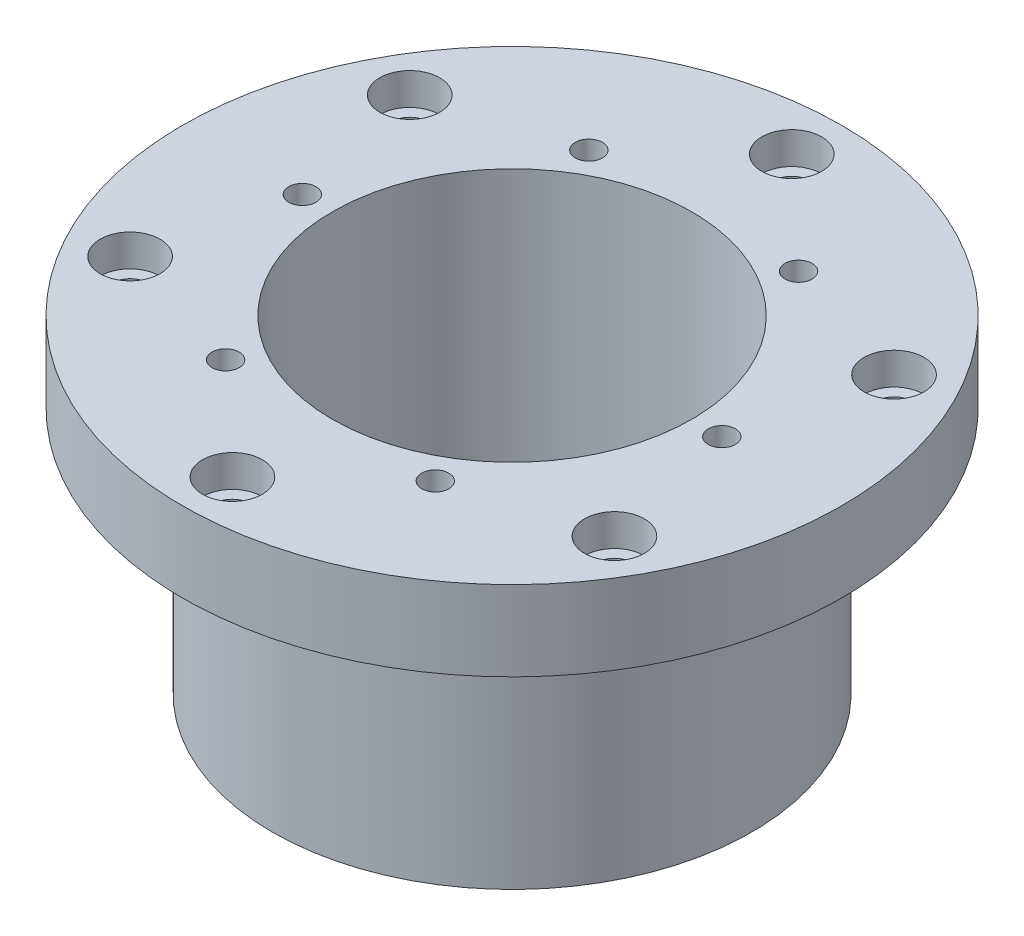
ISO-10303-21;
HEADER;
FILE_DESCRIPTION(('STEP AP214'),'2;1');
FILE_NAME('part.step','',(''),(''),'','','');
FILE_SCHEMA(('AUTOMOTIVE_DESIGN { 1 0 10303 214 1 1 1 1 }'));
ENDSEC;
DATA;
#1=APPLICATION_CONTEXT('core data for automotive mechanical design processes');
#2=APPLICATION_PROTOCOL_DEFINITION('international standard','automotive_design',2000,#1);
#3=PRODUCT_CONTEXT('',#1,'mechanical');
#4=PRODUCT('Part','Part','',(#3));
#5=PRODUCT_RELATED_PRODUCT_CATEGORY('part','',(#4));
#6=PRODUCT_DEFINITION_FORMATION('','',#4);
#7=PRODUCT_DEFINITION_CONTEXT('part definition',#1,'design');
#8=PRODUCT_DEFINITION('design','',#6,#7);
#9=PRODUCT_DEFINITION_SHAPE('','',#8);
#10=(LENGTH_UNIT() NAMED_UNIT(*) SI_UNIT(.MILLI.,.METRE.));
#11=(NAMED_UNIT(*) PLANE_ANGLE_UNIT() SI_UNIT($,.RADIAN.));
#12=(NAMED_UNIT(*) SI_UNIT($,.STERADIAN.) SOLID_ANGLE_UNIT());
#13=UNCERTAINTY_MEASURE_WITH_UNIT(LENGTH_MEASURE(1.E-05),#10,'distance_accuracy_value','');
#14=(GEOMETRIC_REPRESENTATION_CONTEXT(3) GLOBAL_UNCERTAINTY_ASSIGNED_CONTEXT((#13)) GLOBAL_UNIT_ASSIGNED_CONTEXT((#10,
#11,#12)) REPRESENTATION_CONTEXT('',''));
#15=CARTESIAN_POINT('',(0.,0.,0.));
#16=DIRECTION('',(0.,0.,1.));
#17=DIRECTION('',(1.,0.,0.));
#18=AXIS2_PLACEMENT_3D('',#15,#16,#17);
#19=CARTESIAN_POINT('',(0.,-62.,0.));
#20=DIRECTION('',(0.,-1.,0.));
#21=DIRECTION('',(0.,0.,-1.));
#22=AXIS2_PLACEMENT_3D('',#19,#20,#21);
#23=PLANE('',#22);
#24=CARTESIAN_POINT('',(0.,-62.,0.));
#25=DIRECTION('',(0.,1.,0.));
#26=DIRECTION('',(0.,0.,1.));
#27=AXIS2_PLACEMENT_3D('',#24,#25,#26);
#28=CIRCLE('',#27,60.);
#29=CARTESIAN_POINT('',(0.,-62.,60.));
#30=VERTEX_POINT('',#29);
#31=EDGE_CURVE('E166',#30,#30,#28,.T.);
#32=ORIENTED_EDGE('',*,*,#31,.F.);
#33=EDGE_LOOP('',(#32));
#34=FACE_BOUND('',#33,.T.);
#35=CARTESIAN_POINT('',(0.,-62.,0.));
#36=DIRECTION('',(0.,1.,0.));
#37=DIRECTION('',(0.,0.,1.));
#38=AXIS2_PLACEMENT_3D('',#35,#36,#37);
#39=CIRCLE('',#38,37.5);
#40=CARTESIAN_POINT('',(0.,-62.,37.5));
#41=VERTEX_POINT('',#40);
#42=EDGE_CURVE('E20',#41,#41,#39,.T.);
#43=ORIENTED_EDGE('',*,*,#42,.T.);
#44=EDGE_LOOP('',(#43));
#45=FACE_BOUND('',#44,.T.);
#46=ADVANCED_FACE('F17',(#34,#45),#23,.T.);
#47=CARTESIAN_POINT('',(0.,-62.,0.));
#48=DIRECTION('',(0.,1.,0.));
#49=DIRECTION('',(0.,0.,1.));
#50=AXIS2_PLACEMENT_3D('',#47,#48,#49);
#51=CYLINDRICAL_SURFACE('',#50,37.5);
#52=CARTESIAN_POINT('',(0.,-52.,0.));
#53=DIRECTION('',(0.,1.,0.));
#54=DIRECTION('',(0.,0.,1.));
#55=AXIS2_PLACEMENT_3D('',#52,#53,#54);
#56=CIRCLE('',#55,37.5);
#57=CARTESIAN_POINT('',(0.,-52.,37.5));
#58=VERTEX_POINT('',#57);
#59=EDGE_CURVE('E146',#58,#58,#56,.F.);
#60=ORIENTED_EDGE('',*,*,#59,.F.);
#61=EDGE_LOOP('',(#60));
#62=FACE_BOUND('',#61,.T.);
#63=ORIENTED_EDGE('',*,*,#42,.F.);
#64=EDGE_LOOP('',(#63));
#65=FACE_BOUND('',#64,.T.);
#66=ADVANCED_FACE('F174',(#62,#65),#51,.F.);
#67=CARTESIAN_POINT('',(60.6217782649103,20.,-35.0000000000007));
#68=DIRECTION('',(0.,1.,0.));
#69=DIRECTION('',(0.,0.,1.));
#70=AXIS2_PLACEMENT_3D('',#67,#68,#69);
#71=CYLINDRICAL_SURFACE('',#70,4.5);
#72=CARTESIAN_POINT('',(60.6217782649103,0.,-35.0000000000007));
#73=DIRECTION('',(0.,1.,0.));
#74=DIRECTION('',(0.,0.,1.));
#75=AXIS2_PLACEMENT_3D('',#72,#73,#74);
#76=CIRCLE('',#75,4.5);
#77=CARTESIAN_POINT('',(60.6217782649103,0.,-30.5000000000007));
#78=VERTEX_POINT('',#77);
#79=EDGE_CURVE('E143',#78,#78,#76,.F.);
#80=ORIENTED_EDGE('',*,*,#79,.T.);
#81=EDGE_LOOP('',(#80));
#82=FACE_BOUND('',#81,.T.);
#83=CARTESIAN_POINT('',(60.6217782649103,12.,-35.0000000000007));
#84=DIRECTION('',(0.,1.,0.));
#85=DIRECTION('',(0.,0.,1.));
#86=AXIS2_PLACEMENT_3D('',#83,#84,#85);
#87=CIRCLE('',#86,4.5);
#88=CARTESIAN_POINT('',(60.6217782649103,12.,-30.5000000000007));
#89=VERTEX_POINT('',#88);
#90=EDGE_CURVE('E164',#89,#89,#87,.T.);
#91=ORIENTED_EDGE('',*,*,#90,.T.);
#92=EDGE_LOOP('',(#91));
#93=FACE_BOUND('',#92,.T.);
#94=ADVANCED_FACE('F176',(#82,#93),#71,.F.);
#95=CARTESIAN_POINT('',(60.621778264911,20.,34.9999999999995));
#96=DIRECTION('',(0.,1.,0.));
#97=DIRECTION('',(0.,0.,1.));
#98=AXIS2_PLACEMENT_3D('',#95,#96,#97);
#99=CYLINDRICAL_SURFACE('',#98,4.5);
#100=CARTESIAN_POINT('',(60.621778264911,0.,34.9999999999995));
#101=DIRECTION('',(0.,1.,0.));
#102=DIRECTION('',(0.,0.,1.));
#103=AXIS2_PLACEMENT_3D('',#100,#101,#102);
#104=CIRCLE('',#103,4.5);
#105=CARTESIAN_POINT('',(60.621778264911,0.,39.4999999999995));
#106=VERTEX_POINT('',#105);
#107=EDGE_CURVE('E140',#106,#106,#104,.F.);
#108=ORIENTED_EDGE('',*,*,#107,.T.);
#109=EDGE_LOOP('',(#108));
#110=FACE_BOUND('',#109,.T.);
#111=CARTESIAN_POINT('',(60.621778264911,12.,34.9999999999995));
#112=DIRECTION('',(0.,1.,0.));
#113=DIRECTION('',(0.,0.,1.));
#114=AXIS2_PLACEMENT_3D('',#111,#112,#113);
#115=CIRCLE('',#114,4.5);
#116=CARTESIAN_POINT('',(60.621778264911,12.,39.4999999999995));
#117=VERTEX_POINT('',#116);
#118=EDGE_CURVE('E161',#117,#117,#115,.T.);
#119=ORIENTED_EDGE('',*,*,#118,.T.);
#120=EDGE_LOOP('',(#119));
#121=FACE_BOUND('',#120,.T.);
#122=ADVANCED_FACE('F184',(#110,#121),#99,.F.);
#123=CARTESIAN_POINT('',(0.,20.,70.));
#124=DIRECTION('',(0.,1.,0.));
#125=DIRECTION('',(0.,0.,1.));
#126=AXIS2_PLACEMENT_3D('',#123,#124,#125);
#127=CYLINDRICAL_SURFACE('',#126,4.5);
#128=CARTESIAN_POINT('',(0.,0.,70.));
#129=DIRECTION('',(0.,1.,0.));
#130=DIRECTION('',(0.,0.,1.));
#131=AXIS2_PLACEMENT_3D('',#128,#129,#130);
#132=CIRCLE('',#131,4.5);
#133=CARTESIAN_POINT('',(0.,0.,74.5));
#134=VERTEX_POINT('',#133);
#135=EDGE_CURVE('E137',#134,#134,#132,.F.);
#136=ORIENTED_EDGE('',*,*,#135,.T.);
#137=EDGE_LOOP('',(#136));
#138=FACE_BOUND('',#137,.T.);
#139=CARTESIAN_POINT('',(0.,12.,70.));
#140=DIRECTION('',(0.,1.,0.));
#141=DIRECTION('',(0.,0.,1.));
#142=AXIS2_PLACEMENT_3D('',#139,#140,#141);
#143=CIRCLE('',#142,4.5);
#144=CARTESIAN_POINT('',(0.,12.,74.5));
#145=VERTEX_POINT('',#144);
#146=EDGE_CURVE('E158',#145,#145,#143,.T.);
#147=ORIENTED_EDGE('',*,*,#146,.T.);
#148=EDGE_LOOP('',(#147));
#149=FACE_BOUND('',#148,.T.);
#150=ADVANCED_FACE('F316',(#138,#149),#127,.F.);
#151=CARTESIAN_POINT('',(-60.6217782649106,20.,35.));
#152=DIRECTION('',(0.,1.,0.));
#153=DIRECTION('',(0.,0.,1.));
#154=AXIS2_PLACEMENT_3D('',#151,#152,#153);
#155=CYLINDRICAL_SURFACE('',#154,4.5);
#156=CARTESIAN_POINT('',(-60.6217782649106,0.,35.));
#157=DIRECTION('',(0.,1.,0.));
#158=DIRECTION('',(0.,0.,1.));
#159=AXIS2_PLACEMENT_3D('',#156,#157,#158);
#160=CIRCLE('',#159,4.5);
#161=CARTESIAN_POINT('',(-60.6217782649106,0.,39.5));
#162=VERTEX_POINT('',#161);
#163=EDGE_CURVE('E134',#162,#162,#160,.F.);
#164=ORIENTED_EDGE('',*,*,#163,.T.);
#165=EDGE_LOOP('',(#164));
#166=FACE_BOUND('',#165,.T.);
#167=CARTESIAN_POINT('',(-60.6217782649106,12.,35.));
#168=DIRECTION('',(0.,1.,0.));
#169=DIRECTION('',(0.,0.,1.));
#170=AXIS2_PLACEMENT_3D('',#167,#168,#169);
#171=CIRCLE('',#170,4.5);
#172=CARTESIAN_POINT('',(-60.6217782649106,12.,39.5));
#173=VERTEX_POINT('',#172);
#174=EDGE_CURVE('E155',#173,#173,#171,.T.);
#175=ORIENTED_EDGE('',*,*,#174,.T.);
#176=EDGE_LOOP('',(#175));
#177=FACE_BOUND('',#176,.T.);
#178=ADVANCED_FACE('F312',(#166,#177),#155,.F.);
#179=CARTESIAN_POINT('',(-60.6217782649108,20.,-35.));
#180=DIRECTION('',(0.,1.,0.));
#181=DIRECTION('',(0.,0.,1.));
#182=AXIS2_PLACEMENT_3D('',#179,#180,#181);
#183=CYLINDRICAL_SURFACE('',#182,4.5);
#184=CARTESIAN_POINT('',(-60.6217782649108,0.,-35.));
#185=DIRECTION('',(0.,1.,0.));
#186=DIRECTION('',(0.,0.,1.));
#187=AXIS2_PLACEMENT_3D('',#184,#185,#186);
#188=CIRCLE('',#187,4.5);
#189=CARTESIAN_POINT('',(-60.6217782649108,0.,-30.5));
#190=VERTEX_POINT('',#189);
#191=EDGE_CURVE('E131',#190,#190,#188,.F.);
#192=ORIENTED_EDGE('',*,*,#191,.T.);
#193=EDGE_LOOP('',(#192));
#194=FACE_BOUND('',#193,.T.);
#195=CARTESIAN_POINT('',(-60.6217782649108,12.,-35.));
#196=DIRECTION('',(0.,1.,0.));
#197=DIRECTION('',(0.,0.,1.));
#198=AXIS2_PLACEMENT_3D('',#195,#196,#197);
#199=CIRCLE('',#198,4.5);
#200=CARTESIAN_POINT('',(-60.6217782649108,12.,-30.5));
#201=VERTEX_POINT('',#200);
#202=EDGE_CURVE('E152',#201,#201,#199,.T.);
#203=ORIENTED_EDGE('',*,*,#202,.T.);
#204=EDGE_LOOP('',(#203));
#205=FACE_BOUND('',#204,.T.);
#206=ADVANCED_FACE('F308',(#194,#205),#183,.F.);
#207=CARTESIAN_POINT('',(0.,20.,-70.));
#208=DIRECTION('',(0.,1.,0.));
#209=DIRECTION('',(0.,0.,1.));
#210=AXIS2_PLACEMENT_3D('',#207,#208,#209);
#211=CYLINDRICAL_SURFACE('',#210,4.5);
#212=CARTESIAN_POINT('',(0.,0.,-70.));
#213=DIRECTION('',(0.,1.,0.));
#214=DIRECTION('',(0.,0.,1.));
#215=AXIS2_PLACEMENT_3D('',#212,#213,#214);
#216=CIRCLE('',#215,4.5);
#217=CARTESIAN_POINT('',(0.,0.,-65.5));
#218=VERTEX_POINT('',#217);
#219=EDGE_CURVE('E62',#218,#218,#216,.F.);
#220=ORIENTED_EDGE('',*,*,#219,.T.);
#221=EDGE_LOOP('',(#220));
#222=FACE_BOUND('',#221,.T.);
#223=CARTESIAN_POINT('',(0.,12.,-70.));
#224=DIRECTION('',(0.,1.,0.));
#225=DIRECTION('',(0.,0.,1.));
#226=AXIS2_PLACEMENT_3D('',#223,#224,#225);
#227=CIRCLE('',#226,4.5);
#228=CARTESIAN_POINT('',(0.,12.,-65.5));
#229=VERTEX_POINT('',#228);
#230=EDGE_CURVE('E149',#229,#229,#227,.T.);
#231=ORIENTED_EDGE('',*,*,#230,.T.);
#232=EDGE_LOOP('',(#231));
#233=FACE_BOUND('',#232,.T.);
#234=ADVANCED_FACE('F305',(#222,#233),#211,.F.);
#235=CARTESIAN_POINT('',(0.,-62.,0.));
#236=DIRECTION('',(0.,1.,0.));
#237=DIRECTION('',(0.,0.,1.));
#238=AXIS2_PLACEMENT_3D('',#235,#236,#237);
#239=CYLINDRICAL_SURFACE('',#238,60.);
#240=ORIENTED_EDGE('',*,*,#31,.T.);
#241=EDGE_LOOP('',(#240));
#242=FACE_BOUND('',#241,.T.);
#243=CARTESIAN_POINT('',(0.,0.,0.));
#244=DIRECTION('',(0.,1.,0.));
#245=DIRECTION('',(0.,0.,1.));
#246=AXIS2_PLACEMENT_3D('',#243,#244,#245);
#247=CIRCLE('',#246,60.);
#248=CARTESIAN_POINT('',(0.,0.,60.));
#249=VERTEX_POINT('',#248);
#250=EDGE_CURVE('E56',#249,#249,#247,.F.);
#251=ORIENTED_EDGE('',*,*,#250,.T.);
#252=EDGE_LOOP('',(#251));
#253=FACE_BOUND('',#252,.T.);
#254=ADVANCED_FACE('F49',(#242,#253),#239,.T.);
#255=CARTESIAN_POINT('',(26.2500000000006,0.249999999994089,45.4663336986827));
#256=DIRECTION('',(0.,1.,0.));
#257=DIRECTION('',(0.,0.,1.));
#258=AXIS2_PLACEMENT_3D('',#255,#256,#257);
#259=CONICAL_SURFACE('',#258,3.40000000012838,1.02974425869086);
#260=CARTESIAN_POINT('',(26.2500000000006,-1.79292610468451,45.4663336986259));
#261=VERTEX_POINT('',#260);
#262=VERTEX_LOOP('',#261);
#263=FACE_BOUND('',#262,.T.);
#264=CARTESIAN_POINT('',(26.2500000000006,0.250000000000066,45.4663336986827));
#265=DIRECTION('',(0.,1.,0.));
#266=DIRECTION('',(0.,0.,1.));
#267=AXIS2_PLACEMENT_3D('',#264,#265,#266);
#268=CIRCLE('',#267,3.39999999999976);
#269=CARTESIAN_POINT('',(26.2500000000006,0.250000000000066,48.8663336986825));
#270=VERTEX_POINT('',#269);
#271=EDGE_CURVE('E53',#270,#270,#268,.T.);
#272=ORIENTED_EDGE('',*,*,#271,.T.);
#273=EDGE_LOOP('',(#272));
#274=FACE_BOUND('',#273,.T.);
#275=ADVANCED_FACE('F45',(#263,#274),#259,.F.);
#276=CARTESIAN_POINT('',(-26.2499999999996,0.249999999937245,45.4663336986833));
#277=DIRECTION('',(0.,1.,0.));
#278=DIRECTION('',(0.,0.,1.));
#279=AXIS2_PLACEMENT_3D('',#276,#277,#278);
#280=CONICAL_SURFACE('',#279,3.3999999999573,1.0297442586087);
#281=CARTESIAN_POINT('',(-26.2499999999996,-1.7929261047982,45.4663336987401));
#282=VERTEX_POINT('',#281);
#283=VERTEX_LOOP('',#282);
#284=FACE_BOUND('',#283,.T.);
#285=CARTESIAN_POINT('',(-26.2499999999996,0.250000000000066,45.4663336986833));
#286=DIRECTION('',(0.,1.,0.));
#287=DIRECTION('',(0.,0.,1.));
#288=AXIS2_PLACEMENT_3D('',#285,#286,#287);
#289=CIRCLE('',#288,3.39999999999976);
#290=CARTESIAN_POINT('',(-26.2499999999996,0.250000000000066,48.8663336986831));
#291=VERTEX_POINT('',#290);
#292=EDGE_CURVE('E55',#291,#291,#289,.T.);
#293=ORIENTED_EDGE('',*,*,#292,.T.);
#294=EDGE_LOOP('',(#293));
#295=FACE_BOUND('',#294,.T.);
#296=ADVANCED_FACE('F48',(#284,#295),#280,.F.);
#297=CARTESIAN_POINT('',(-52.5,0.249999999937245,0.));
#298=DIRECTION('',(0.,1.,0.));
#299=DIRECTION('',(0.,0.,1.));
#300=AXIS2_PLACEMENT_3D('',#297,#298,#299);
#301=CONICAL_SURFACE('',#300,3.3999999998855,1.02974425863677);
#302=CARTESIAN_POINT('',(-52.5,-1.79292610468451,5.6843418860808E-11));
#303=VERTEX_POINT('',#302);
#304=VERTEX_LOOP('',#303);
#305=FACE_BOUND('',#304,.T.);
#306=CARTESIAN_POINT('',(-52.5,0.250000000000066,0.));
#307=DIRECTION('',(0.,1.,0.));
#308=DIRECTION('',(0.,0.,1.));
#309=AXIS2_PLACEMENT_3D('',#306,#307,#308);
#310=CIRCLE('',#309,3.39999999999975);
#311=CARTESIAN_POINT('',(-52.5,0.250000000000066,3.39999999999975));
#312=VERTEX_POINT('',#311);
#313=EDGE_CURVE('E59',#312,#312,#310,.T.);
#314=ORIENTED_EDGE('',*,*,#313,.T.);
#315=EDGE_LOOP('',(#314));
#316=FACE_BOUND('',#315,.T.);
#317=ADVANCED_FACE('F296',(#305,#316),#301,.F.);
#318=CARTESIAN_POINT('',(-26.25,0.250000000107775,-45.4663336986829));
#319=DIRECTION('',(0.,1.,0.));
#320=DIRECTION('',(0.,0.,1.));
#321=AXIS2_PLACEMENT_3D('',#318,#319,#320);
#322=CONICAL_SURFACE('',#321,3.40000000009754,1.02974425867217);
#323=CARTESIAN_POINT('',(-26.25,-1.79292610462767,-45.4663336986261));
#324=VERTEX_POINT('',#323);
#325=VERTEX_LOOP('',#324);
#326=FACE_BOUND('',#325,.T.);
#327=CARTESIAN_POINT('',(-26.25,0.250000000000066,-45.4663336986829));
#328=DIRECTION('',(0.,1.,0.));
#329=DIRECTION('',(0.,0.,1.));
#330=AXIS2_PLACEMENT_3D('',#327,#328,#329);
#331=CIRCLE('',#330,3.39999999999975);
#332=CARTESIAN_POINT('',(-26.25,0.250000000000066,-42.0663336986832));
#333=VERTEX_POINT('',#332);
#334=EDGE_CURVE('E595',#333,#333,#331,.T.);
#335=ORIENTED_EDGE('',*,*,#334,.T.);
#336=EDGE_LOOP('',(#335));
#337=FACE_BOUND('',#336,.T.);
#338=ADVANCED_FACE('F292',(#326,#337),#322,.F.);
#339=CARTESIAN_POINT('',(26.25,0.249999999937245,-45.4663336986831));
#340=DIRECTION('',(0.,1.,0.));
#341=DIRECTION('',(0.,0.,1.));
#342=AXIS2_PLACEMENT_3D('',#339,#340,#341);
#343=CONICAL_SURFACE('',#342,3.39999999987034,1.02974425862055);
#344=CARTESIAN_POINT('',(26.25,-1.79292610474135,-45.4663336986262));
#345=VERTEX_POINT('',#344);
#346=VERTEX_LOOP('',#345);
#347=FACE_BOUND('',#346,.T.);
#348=CARTESIAN_POINT('',(26.25,0.250000000000066,-45.4663336986831));
#349=DIRECTION('',(0.,1.,0.));
#350=DIRECTION('',(0.,0.,1.));
#351=AXIS2_PLACEMENT_3D('',#348,#349,#350);
#352=CIRCLE('',#351,3.39999999999976);
#353=CARTESIAN_POINT('',(26.25,0.250000000000066,-42.0663336986833));
#354=VERTEX_POINT('',#353);
#355=EDGE_CURVE('E597',#354,#354,#352,.T.);
#356=ORIENTED_EDGE('',*,*,#355,.T.);
#357=EDGE_LOOP('',(#356));
#358=FACE_BOUND('',#357,.T.);
#359=ADVANCED_FACE('F289',(#347,#358),#343,.F.);
#360=CARTESIAN_POINT('',(52.5,0.249999999937245,0.));
#361=DIRECTION('',(0.,1.,0.));
#362=DIRECTION('',(0.,0.,1.));
#363=AXIS2_PLACEMENT_3D('',#360,#361,#362);
#364=CONICAL_SURFACE('',#363,3.3999999998855,1.02974425863677);
#365=CARTESIAN_POINT('',(52.5,-1.79292610468451,5.6843418860808E-11));
#366=VERTEX_POINT('',#365);
#367=VERTEX_LOOP('',#366);
#368=FACE_BOUND('',#367,.T.);
#369=CARTESIAN_POINT('',(52.5,0.250000000000066,0.));
#370=DIRECTION('',(0.,1.,0.));
#371=DIRECTION('',(0.,0.,1.));
#372=AXIS2_PLACEMENT_3D('',#369,#370,#371);
#373=CIRCLE('',#372,3.39999999999975);
#374=CARTESIAN_POINT('',(52.5,0.250000000000066,3.39999999999975));
#375=VERTEX_POINT('',#374);
#376=EDGE_CURVE('E127',#375,#375,#373,.T.);
#377=ORIENTED_EDGE('',*,*,#376,.T.);
#378=EDGE_LOOP('',(#377));
#379=FACE_BOUND('',#378,.T.);
#380=ADVANCED_FACE('F285',(#368,#379),#364,.F.);
#381=CARTESIAN_POINT('',(65.1217782649103,12.,-35.0000000000007));
#382=DIRECTION('',(0.,-1.,0.));
#383=DIRECTION('',(0.,0.,-1.));
#384=AXIS2_PLACEMENT_3D('',#381,#382,#383);
#385=PLANE('',#384);
#386=CARTESIAN_POINT('',(60.6217782649103,12.,-35.0000000000007));
#387=DIRECTION('',(0.,1.,0.));
#388=DIRECTION('',(0.,0.,1.));
#389=AXIS2_PLACEMENT_3D('',#386,#387,#388);
#390=CIRCLE('',#389,7.5);
#391=CARTESIAN_POINT('',(60.6217782649103,12.,-27.5000000000007));
#392=VERTEX_POINT('',#391);
#393=EDGE_CURVE('E125',#392,#392,#390,.T.);
#394=ORIENTED_EDGE('',*,*,#393,.T.);
#395=EDGE_LOOP('',(#394));
#396=FACE_BOUND('',#395,.T.);
#397=ORIENTED_EDGE('',*,*,#90,.F.);
#398=EDGE_LOOP('',(#397));
#399=FACE_BOUND('',#398,.T.);
#400=ADVANCED_FACE('F281',(#396,#399),#385,.F.);
#401=CARTESIAN_POINT('',(65.121778264911,12.,34.9999999999995));
#402=DIRECTION('',(0.,-1.,0.));
#403=DIRECTION('',(0.,0.,-1.));
#404=AXIS2_PLACEMENT_3D('',#401,#402,#403);
#405=PLANE('',#404);
#406=CARTESIAN_POINT('',(60.621778264911,12.,34.9999999999995));
#407=DIRECTION('',(0.,1.,0.));
#408=DIRECTION('',(0.,0.,1.));
#409=AXIS2_PLACEMENT_3D('',#406,#407,#408);
#410=CIRCLE('',#409,7.5);
#411=CARTESIAN_POINT('',(60.621778264911,12.,42.4999999999995));
#412=VERTEX_POINT('',#411);
#413=EDGE_CURVE('E122',#412,#412,#410,.T.);
#414=ORIENTED_EDGE('',*,*,#413,.T.);
#415=EDGE_LOOP('',(#414));
#416=FACE_BOUND('',#415,.T.);
#417=ORIENTED_EDGE('',*,*,#118,.F.);
#418=EDGE_LOOP('',(#417));
#419=FACE_BOUND('',#418,.T.);
#420=ADVANCED_FACE('F277',(#416,#419),#405,.F.);
#421=CARTESIAN_POINT('',(4.5,12.,70.));
#422=DIRECTION('',(0.,-1.,0.));
#423=DIRECTION('',(0.,0.,-1.));
#424=AXIS2_PLACEMENT_3D('',#421,#422,#423);
#425=PLANE('',#424);
#426=CARTESIAN_POINT('',(0.,12.,70.));
#427=DIRECTION('',(0.,1.,0.));
#428=DIRECTION('',(0.,0.,1.));
#429=AXIS2_PLACEMENT_3D('',#426,#427,#428);
#430=CIRCLE('',#429,7.5);
#431=CARTESIAN_POINT('',(0.,12.,77.5));
#432=VERTEX_POINT('',#431);
#433=EDGE_CURVE('E119',#432,#432,#430,.T.);
#434=ORIENTED_EDGE('',*,*,#433,.T.);
#435=EDGE_LOOP('',(#434));
#436=FACE_BOUND('',#435,.T.);
#437=ORIENTED_EDGE('',*,*,#146,.F.);
#438=EDGE_LOOP('',(#437));
#439=FACE_BOUND('',#438,.T.);
#440=ADVANCED_FACE('F273',(#436,#439),#425,.F.);
#441=CARTESIAN_POINT('',(-56.1217782649106,12.,35.));
#442=DIRECTION('',(0.,-1.,0.));
#443=DIRECTION('',(0.,0.,-1.));
#444=AXIS2_PLACEMENT_3D('',#441,#442,#443);
#445=PLANE('',#444);
#446=CARTESIAN_POINT('',(-60.6217782649106,12.,35.));
#447=DIRECTION('',(0.,1.,0.));
#448=DIRECTION('',(0.,0.,1.));
#449=AXIS2_PLACEMENT_3D('',#446,#447,#448);
#450=CIRCLE('',#449,7.5);
#451=CARTESIAN_POINT('',(-60.6217782649106,12.,42.5));
#452=VERTEX_POINT('',#451);
#453=EDGE_CURVE('E116',#452,#452,#450,.T.);
#454=ORIENTED_EDGE('',*,*,#453,.T.);
#455=EDGE_LOOP('',(#454));
#456=FACE_BOUND('',#455,.T.);
#457=ORIENTED_EDGE('',*,*,#174,.F.);
#458=EDGE_LOOP('',(#457));
#459=FACE_BOUND('',#458,.T.);
#460=ADVANCED_FACE('F269',(#456,#459),#445,.F.);
#461=CARTESIAN_POINT('',(-56.1217782649108,12.,-35.));
#462=DIRECTION('',(0.,-1.,0.));
#463=DIRECTION('',(0.,0.,-1.));
#464=AXIS2_PLACEMENT_3D('',#461,#462,#463);
#465=PLANE('',#464);
#466=CARTESIAN_POINT('',(-60.6217782649108,12.,-35.));
#467=DIRECTION('',(0.,1.,0.));
#468=DIRECTION('',(0.,0.,1.));
#469=AXIS2_PLACEMENT_3D('',#466,#467,#468);
#470=CIRCLE('',#469,7.5);
#471=CARTESIAN_POINT('',(-60.6217782649108,12.,-27.5));
#472=VERTEX_POINT('',#471);
#473=EDGE_CURVE('E113',#472,#472,#470,.T.);
#474=ORIENTED_EDGE('',*,*,#473,.T.);
#475=EDGE_LOOP('',(#474));
#476=FACE_BOUND('',#475,.T.);
#477=ORIENTED_EDGE('',*,*,#202,.F.);
#478=EDGE_LOOP('',(#477));
#479=FACE_BOUND('',#478,.T.);
#480=ADVANCED_FACE('F265',(#476,#479),#465,.F.);
#481=CARTESIAN_POINT('',(4.5,12.,-70.));
#482=DIRECTION('',(0.,-1.,0.));
#483=DIRECTION('',(0.,0.,-1.));
#484=AXIS2_PLACEMENT_3D('',#481,#482,#483);
#485=PLANE('',#484);
#486=CARTESIAN_POINT('',(0.,12.,-70.));
#487=DIRECTION('',(0.,1.,0.));
#488=DIRECTION('',(0.,0.,1.));
#489=AXIS2_PLACEMENT_3D('',#486,#487,#488);
#490=CIRCLE('',#489,7.5);
#491=CARTESIAN_POINT('',(0.,12.,-62.5));
#492=VERTEX_POINT('',#491);
#493=EDGE_CURVE('E110',#492,#492,#490,.T.);
#494=ORIENTED_EDGE('',*,*,#493,.T.);
#495=EDGE_LOOP('',(#494));
#496=FACE_BOUND('',#495,.T.);
#497=ORIENTED_EDGE('',*,*,#230,.F.);
#498=EDGE_LOOP('',(#497));
#499=FACE_BOUND('',#498,.T.);
#500=ADVANCED_FACE('F261',(#496,#499),#485,.F.);
#501=CARTESIAN_POINT('',(0.,-52.,0.));
#502=DIRECTION('',(0.,1.,0.));
#503=DIRECTION('',(0.,0.,1.));
#504=AXIS2_PLACEMENT_3D('',#501,#502,#503);
#505=PLANE('',#504);
#506=CARTESIAN_POINT('',(0.,-52.,0.));
#507=DIRECTION('',(0.,1.,0.));
#508=DIRECTION('',(0.,0.,1.));
#509=AXIS2_PLACEMENT_3D('',#506,#507,#508);
#510=CIRCLE('',#509,45.);
#511=CARTESIAN_POINT('',(0.,-52.,45.));
#512=VERTEX_POINT('',#511);
#513=EDGE_CURVE('E107',#512,#512,#510,.T.);
#514=ORIENTED_EDGE('',*,*,#513,.T.);
#515=EDGE_LOOP('',(#514));
#516=FACE_BOUND('',#515,.T.);
#517=ORIENTED_EDGE('',*,*,#59,.T.);
#518=EDGE_LOOP('',(#517));
#519=FACE_BOUND('',#518,.T.);
#520=ADVANCED_FACE('F257',(#516,#519),#505,.T.);
#521=CARTESIAN_POINT('',(0.,0.,0.));
#522=DIRECTION('',(0.,1.,0.));
#523=DIRECTION('',(0.,0.,1.));
#524=AXIS2_PLACEMENT_3D('',#521,#522,#523);
#525=PLANE('',#524);
#526=ORIENTED_EDGE('',*,*,#250,.F.);
#527=EDGE_LOOP('',(#526));
#528=FACE_BOUND('',#527,.T.);
#529=CARTESIAN_POINT('',(0.,0.,0.));
#530=DIRECTION('',(0.,-1.,0.));
#531=DIRECTION('',(0.,0.,-1.));
#532=AXIS2_PLACEMENT_3D('',#529,#530,#531);
#533=CIRCLE('',#532,82.5);
#534=CARTESIAN_POINT('',(0.,0.,-82.5));
#535=VERTEX_POINT('',#534);
#536=EDGE_CURVE('E104',#535,#535,#533,.F.);
#537=ORIENTED_EDGE('',*,*,#536,.F.);
#538=EDGE_LOOP('',(#537));
#539=FACE_BOUND('',#538,.T.);
#540=ORIENTED_EDGE('',*,*,#219,.F.);
#541=EDGE_LOOP('',(#540));
#542=FACE_BOUND('',#541,.T.);
#543=ORIENTED_EDGE('',*,*,#191,.F.);
#544=EDGE_LOOP('',(#543));
#545=FACE_BOUND('',#544,.T.);
#546=ORIENTED_EDGE('',*,*,#163,.F.);
#547=EDGE_LOOP('',(#546));
#548=FACE_BOUND('',#547,.T.);
#549=ORIENTED_EDGE('',*,*,#135,.F.);
#550=EDGE_LOOP('',(#549));
#551=FACE_BOUND('',#550,.T.);
#552=ORIENTED_EDGE('',*,*,#107,.F.);
#553=EDGE_LOOP('',(#552));
#554=FACE_BOUND('',#553,.T.);
#555=ORIENTED_EDGE('',*,*,#79,.F.);
#556=EDGE_LOOP('',(#555));
#557=FACE_BOUND('',#556,.T.);
#558=ADVANCED_FACE('F253',(#528,#539,#542,#545,#548,#551,#554,#557),#525,.F.);
#559=CARTESIAN_POINT('',(26.2500000000006,20.,45.4663336986827));
#560=DIRECTION('',(0.,1.,0.));
#561=DIRECTION('',(0.,0.,1.));
#562=AXIS2_PLACEMENT_3D('',#559,#560,#561);
#563=CYLINDRICAL_SURFACE('',#562,3.39999999999976);
#564=CARTESIAN_POINT('',(26.2500000000006,20.,45.4663336986827));
#565=DIRECTION('',(0.,1.,0.));
#566=DIRECTION('',(0.,0.,1.));
#567=AXIS2_PLACEMENT_3D('',#564,#565,#566);
#568=CIRCLE('',#567,3.39999999999976);
#569=CARTESIAN_POINT('',(26.2500000000006,20.,48.8663336986825));
#570=VERTEX_POINT('',#569);
#571=EDGE_CURVE('E101',#570,#570,#568,.F.);
#572=ORIENTED_EDGE('',*,*,#571,.F.);
#573=EDGE_LOOP('',(#572));
#574=FACE_BOUND('',#573,.T.);
#575=ORIENTED_EDGE('',*,*,#271,.F.);
#576=EDGE_LOOP('',(#575));
#577=FACE_BOUND('',#576,.T.);
#578=ADVANCED_FACE('F249',(#574,#577),#563,.F.);
#579=CARTESIAN_POINT('',(-26.2499999999996,20.,45.4663336986833));
#580=DIRECTION('',(0.,1.,0.));
#581=DIRECTION('',(0.,0.,1.));
#582=AXIS2_PLACEMENT_3D('',#579,#580,#581);
#583=CYLINDRICAL_SURFACE('',#582,3.39999999999976);
#584=CARTESIAN_POINT('',(-26.2499999999996,20.,45.4663336986833));
#585=DIRECTION('',(0.,1.,0.));
#586=DIRECTION('',(0.,0.,1.));
#587=AXIS2_PLACEMENT_3D('',#584,#585,#586);
#588=CIRCLE('',#587,3.39999999999976);
#589=CARTESIAN_POINT('',(-26.2499999999996,20.,48.8663336986831));
#590=VERTEX_POINT('',#589);
#591=EDGE_CURVE('E98',#590,#590,#588,.F.);
#592=ORIENTED_EDGE('',*,*,#591,.F.);
#593=EDGE_LOOP('',(#592));
#594=FACE_BOUND('',#593,.T.);
#595=ORIENTED_EDGE('',*,*,#292,.F.);
#596=EDGE_LOOP('',(#595));
#597=FACE_BOUND('',#596,.T.);
#598=ADVANCED_FACE('F245',(#594,#597),#583,.F.);
#599=CARTESIAN_POINT('',(-52.5,20.,0.));
#600=DIRECTION('',(0.,1.,0.));
#601=DIRECTION('',(0.,0.,1.));
#602=AXIS2_PLACEMENT_3D('',#599,#600,#601);
#603=CYLINDRICAL_SURFACE('',#602,3.39999999999975);
#604=CARTESIAN_POINT('',(-52.5,20.,0.));
#605=DIRECTION('',(0.,1.,0.));
#606=DIRECTION('',(0.,0.,1.));
#607=AXIS2_PLACEMENT_3D('',#604,#605,#606);
#608=CIRCLE('',#607,3.39999999999975);
#609=CARTESIAN_POINT('',(-52.5,20.,3.39999999999975));
#610=VERTEX_POINT('',#609);
#611=EDGE_CURVE('E95',#610,#610,#608,.F.);
#612=ORIENTED_EDGE('',*,*,#611,.F.);
#613=EDGE_LOOP('',(#612));
#614=FACE_BOUND('',#613,.T.);
#615=ORIENTED_EDGE('',*,*,#313,.F.);
#616=EDGE_LOOP('',(#615));
#617=FACE_BOUND('',#616,.T.);
#618=ADVANCED_FACE('F241',(#614,#617),#603,.F.);
#619=CARTESIAN_POINT('',(-26.25,20.,-45.4663336986829));
#620=DIRECTION('',(0.,1.,0.));
#621=DIRECTION('',(0.,0.,1.));
#622=AXIS2_PLACEMENT_3D('',#619,#620,#621);
#623=CYLINDRICAL_SURFACE('',#622,3.39999999999975);
#624=CARTESIAN_POINT('',(-26.25,20.,-45.4663336986829));
#625=DIRECTION('',(0.,1.,0.));
#626=DIRECTION('',(0.,0.,1.));
#627=AXIS2_PLACEMENT_3D('',#624,#625,#626);
#628=CIRCLE('',#627,3.39999999999975);
#629=CARTESIAN_POINT('',(-26.25,20.,-42.0663336986832));
#630=VERTEX_POINT('',#629);
#631=EDGE_CURVE('E92',#630,#630,#628,.F.);
#632=ORIENTED_EDGE('',*,*,#631,.F.);
#633=EDGE_LOOP('',(#632));
#634=FACE_BOUND('',#633,.T.);
#635=ORIENTED_EDGE('',*,*,#334,.F.);
#636=EDGE_LOOP('',(#635));
#637=FACE_BOUND('',#636,.T.);
#638=ADVANCED_FACE('F237',(#634,#637),#623,.F.);
#639=CARTESIAN_POINT('',(26.25,20.,-45.4663336986831));
#640=DIRECTION('',(0.,1.,0.));
#641=DIRECTION('',(0.,0.,1.));
#642=AXIS2_PLACEMENT_3D('',#639,#640,#641);
#643=CYLINDRICAL_SURFACE('',#642,3.39999999999976);
#644=CARTESIAN_POINT('',(26.25,20.,-45.4663336986831));
#645=DIRECTION('',(0.,1.,0.));
#646=DIRECTION('',(0.,0.,1.));
#647=AXIS2_PLACEMENT_3D('',#644,#645,#646);
#648=CIRCLE('',#647,3.39999999999976);
#649=CARTESIAN_POINT('',(26.25,20.,-42.0663336986833));
#650=VERTEX_POINT('',#649);
#651=EDGE_CURVE('E89',#650,#650,#648,.F.);
#652=ORIENTED_EDGE('',*,*,#651,.F.);
#653=EDGE_LOOP('',(#652));
#654=FACE_BOUND('',#653,.T.);
#655=ORIENTED_EDGE('',*,*,#355,.F.);
#656=EDGE_LOOP('',(#655));
#657=FACE_BOUND('',#656,.T.);
#658=ADVANCED_FACE('F233',(#654,#657),#643,.F.);
#659=CARTESIAN_POINT('',(52.5,20.,0.));
#660=DIRECTION('',(0.,1.,0.));
#661=DIRECTION('',(0.,0.,1.));
#662=AXIS2_PLACEMENT_3D('',#659,#660,#661);
#663=CYLINDRICAL_SURFACE('',#662,3.39999999999975);
#664=CARTESIAN_POINT('',(52.5,20.,0.));
#665=DIRECTION('',(0.,1.,0.));
#666=DIRECTION('',(0.,0.,1.));
#667=AXIS2_PLACEMENT_3D('',#664,#665,#666);
#668=CIRCLE('',#667,3.39999999999975);
#669=CARTESIAN_POINT('',(52.5,20.,3.39999999999975));
#670=VERTEX_POINT('',#669);
#671=EDGE_CURVE('E86',#670,#670,#668,.F.);
#672=ORIENTED_EDGE('',*,*,#671,.F.);
#673=EDGE_LOOP('',(#672));
#674=FACE_BOUND('',#673,.T.);
#675=ORIENTED_EDGE('',*,*,#376,.F.);
#676=EDGE_LOOP('',(#675));
#677=FACE_BOUND('',#676,.T.);
#678=ADVANCED_FACE('F229',(#674,#677),#663,.F.);
#679=CARTESIAN_POINT('',(60.6217782649103,20.,-35.0000000000007));
#680=DIRECTION('',(0.,1.,0.));
#681=DIRECTION('',(0.,0.,1.));
#682=AXIS2_PLACEMENT_3D('',#679,#680,#681);
#683=CYLINDRICAL_SURFACE('',#682,7.5);
#684=CARTESIAN_POINT('',(60.6217782649103,20.,-35.0000000000007));
#685=DIRECTION('',(0.,1.,0.));
#686=DIRECTION('',(0.,0.,1.));
#687=AXIS2_PLACEMENT_3D('',#684,#685,#686);
#688=CIRCLE('',#687,7.5);
#689=CARTESIAN_POINT('',(60.6217782649103,20.,-27.5000000000007));
#690=VERTEX_POINT('',#689);
#691=EDGE_CURVE('E83',#690,#690,#688,.F.);
#692=ORIENTED_EDGE('',*,*,#691,.F.);
#693=EDGE_LOOP('',(#692));
#694=FACE_BOUND('',#693,.T.);
#695=ORIENTED_EDGE('',*,*,#393,.F.);
#696=EDGE_LOOP('',(#695));
#697=FACE_BOUND('',#696,.T.);
#698=ADVANCED_FACE('F225',(#694,#697),#683,.F.);
#699=CARTESIAN_POINT('',(60.621778264911,20.,34.9999999999995));
#700=DIRECTION('',(0.,1.,0.));
#701=DIRECTION('',(0.,0.,1.));
#702=AXIS2_PLACEMENT_3D('',#699,#700,#701);
#703=CYLINDRICAL_SURFACE('',#702,7.5);
#704=CARTESIAN_POINT('',(60.621778264911,20.,34.9999999999995));
#705=DIRECTION('',(0.,1.,0.));
#706=DIRECTION('',(0.,0.,1.));
#707=AXIS2_PLACEMENT_3D('',#704,#705,#706);
#708=CIRCLE('',#707,7.5);
#709=CARTESIAN_POINT('',(60.621778264911,20.,42.4999999999995));
#710=VERTEX_POINT('',#709);
#711=EDGE_CURVE('E80',#710,#710,#708,.F.);
#712=ORIENTED_EDGE('',*,*,#711,.F.);
#713=EDGE_LOOP('',(#712));
#714=FACE_BOUND('',#713,.T.);
#715=ORIENTED_EDGE('',*,*,#413,.F.);
#716=EDGE_LOOP('',(#715));
#717=FACE_BOUND('',#716,.T.);
#718=ADVANCED_FACE('F221',(#714,#717),#703,.F.);
#719=CARTESIAN_POINT('',(0.,20.,70.));
#720=DIRECTION('',(0.,1.,0.));
#721=DIRECTION('',(0.,0.,1.));
#722=AXIS2_PLACEMENT_3D('',#719,#720,#721);
#723=CYLINDRICAL_SURFACE('',#722,7.5);
#724=CARTESIAN_POINT('',(0.,20.,70.));
#725=DIRECTION('',(0.,1.,0.));
#726=DIRECTION('',(0.,0.,1.));
#727=AXIS2_PLACEMENT_3D('',#724,#725,#726);
#728=CIRCLE('',#727,7.5);
#729=CARTESIAN_POINT('',(0.,20.,77.5));
#730=VERTEX_POINT('',#729);
#731=EDGE_CURVE('E77',#730,#730,#728,.F.);
#732=ORIENTED_EDGE('',*,*,#731,.F.);
#733=EDGE_LOOP('',(#732));
#734=FACE_BOUND('',#733,.T.);
#735=ORIENTED_EDGE('',*,*,#433,.F.);
#736=EDGE_LOOP('',(#735));
#737=FACE_BOUND('',#736,.T.);
#738=ADVANCED_FACE('F217',(#734,#737),#723,.F.);
#739=CARTESIAN_POINT('',(-60.6217782649106,20.,35.));
#740=DIRECTION('',(0.,1.,0.));
#741=DIRECTION('',(0.,0.,1.));
#742=AXIS2_PLACEMENT_3D('',#739,#740,#741);
#743=CYLINDRICAL_SURFACE('',#742,7.5);
#744=CARTESIAN_POINT('',(-60.6217782649106,20.,35.));
#745=DIRECTION('',(0.,1.,0.));
#746=DIRECTION('',(0.,0.,1.));
#747=AXIS2_PLACEMENT_3D('',#744,#745,#746);
#748=CIRCLE('',#747,7.5);
#749=CARTESIAN_POINT('',(-60.6217782649106,20.,42.5));
#750=VERTEX_POINT('',#749);
#751=EDGE_CURVE('E74',#750,#750,#748,.F.);
#752=ORIENTED_EDGE('',*,*,#751,.F.);
#753=EDGE_LOOP('',(#752));
#754=FACE_BOUND('',#753,.T.);
#755=ORIENTED_EDGE('',*,*,#453,.F.);
#756=EDGE_LOOP('',(#755));
#757=FACE_BOUND('',#756,.T.);
#758=ADVANCED_FACE('F213',(#754,#757),#743,.F.);
#759=CARTESIAN_POINT('',(-60.6217782649108,20.,-35.));
#760=DIRECTION('',(0.,1.,0.));
#761=DIRECTION('',(0.,0.,1.));
#762=AXIS2_PLACEMENT_3D('',#759,#760,#761);
#763=CYLINDRICAL_SURFACE('',#762,7.5);
#764=CARTESIAN_POINT('',(-60.6217782649108,20.,-35.));
#765=DIRECTION('',(0.,1.,0.));
#766=DIRECTION('',(0.,0.,1.));
#767=AXIS2_PLACEMENT_3D('',#764,#765,#766);
#768=CIRCLE('',#767,7.5);
#769=CARTESIAN_POINT('',(-60.6217782649108,20.,-27.5));
#770=VERTEX_POINT('',#769);
#771=EDGE_CURVE('E71',#770,#770,#768,.F.);
#772=ORIENTED_EDGE('',*,*,#771,.F.);
#773=EDGE_LOOP('',(#772));
#774=FACE_BOUND('',#773,.T.);
#775=ORIENTED_EDGE('',*,*,#473,.F.);
#776=EDGE_LOOP('',(#775));
#777=FACE_BOUND('',#776,.T.);
#778=ADVANCED_FACE('F209',(#774,#777),#763,.F.);
#779=CARTESIAN_POINT('',(0.,20.,-70.));
#780=DIRECTION('',(0.,1.,0.));
#781=DIRECTION('',(0.,0.,1.));
#782=AXIS2_PLACEMENT_3D('',#779,#780,#781);
#783=CYLINDRICAL_SURFACE('',#782,7.5);
#784=CARTESIAN_POINT('',(0.,20.,-70.));
#785=DIRECTION('',(0.,1.,0.));
#786=DIRECTION('',(0.,0.,1.));
#787=AXIS2_PLACEMENT_3D('',#784,#785,#786);
#788=CIRCLE('',#787,7.5);
#789=CARTESIAN_POINT('',(0.,20.,-62.5));
#790=VERTEX_POINT('',#789);
#791=EDGE_CURVE('E68',#790,#790,#788,.F.);
#792=ORIENTED_EDGE('',*,*,#791,.F.);
#793=EDGE_LOOP('',(#792));
#794=FACE_BOUND('',#793,.T.);
#795=ORIENTED_EDGE('',*,*,#493,.F.);
#796=EDGE_LOOP('',(#795));
#797=FACE_BOUND('',#796,.T.);
#798=ADVANCED_FACE('F205',(#794,#797),#783,.F.);
#799=CARTESIAN_POINT('',(0.,-52.,0.));
#800=DIRECTION('',(0.,1.,0.));
#801=DIRECTION('',(0.,0.,1.));
#802=AXIS2_PLACEMENT_3D('',#799,#800,#801);
#803=CYLINDRICAL_SURFACE('',#802,45.);
#804=CARTESIAN_POINT('',(0.,20.,0.));
#805=DIRECTION('',(0.,1.,0.));
#806=DIRECTION('',(0.,0.,1.));
#807=AXIS2_PLACEMENT_3D('',#804,#805,#806);
#808=CIRCLE('',#807,45.);
#809=CARTESIAN_POINT('',(0.,20.,45.));
#810=VERTEX_POINT('',#809);
#811=EDGE_CURVE('E26',#810,#810,#808,.F.);
#812=ORIENTED_EDGE('',*,*,#811,.F.);
#813=EDGE_LOOP('',(#812));
#814=FACE_BOUND('',#813,.T.);
#815=ORIENTED_EDGE('',*,*,#513,.F.);
#816=EDGE_LOOP('',(#815));
#817=FACE_BOUND('',#816,.T.);
#818=ADVANCED_FACE('F198',(#814,#817),#803,.F.);
#819=CARTESIAN_POINT('',(0.,20.,0.));
#820=DIRECTION('',(0.,-1.,0.));
#821=DIRECTION('',(0.,0.,-1.));
#822=AXIS2_PLACEMENT_3D('',#819,#820,#821);
#823=CYLINDRICAL_SURFACE('',#822,82.5);
#824=ORIENTED_EDGE('',*,*,#536,.T.);
#825=EDGE_LOOP('',(#824));
#826=FACE_BOUND('',#825,.T.);
#827=CARTESIAN_POINT('',(0.,20.,0.));
#828=DIRECTION('',(0.,-1.,0.));
#829=DIRECTION('',(0.,0.,-1.));
#830=AXIS2_PLACEMENT_3D('',#827,#828,#829);
#831=CIRCLE('',#830,82.5);
#832=CARTESIAN_POINT('',(0.,20.,-82.5));
#833=VERTEX_POINT('',#832);
#834=EDGE_CURVE('E11',#833,#833,#831,.F.);
#835=ORIENTED_EDGE('',*,*,#834,.F.);
#836=EDGE_LOOP('',(#835));
#837=FACE_BOUND('',#836,.T.);
#838=ADVANCED_FACE('F191',(#826,#837),#823,.T.);
#839=CARTESIAN_POINT('',(0.,20.,0.));
#840=DIRECTION('',(0.,1.,0.));
#841=DIRECTION('',(0.,0.,1.));
#842=AXIS2_PLACEMENT_3D('',#839,#840,#841);
#843=PLANE('',#842);
#844=ORIENTED_EDGE('',*,*,#834,.T.);
#845=EDGE_LOOP('',(#844));
#846=FACE_BOUND('',#845,.T.);
#847=ORIENTED_EDGE('',*,*,#811,.T.);
#848=EDGE_LOOP('',(#847));
#849=FACE_BOUND('',#848,.T.);
#850=ORIENTED_EDGE('',*,*,#791,.T.);
#851=EDGE_LOOP('',(#850));
#852=FACE_BOUND('',#851,.T.);
#853=ORIENTED_EDGE('',*,*,#771,.T.);
#854=EDGE_LOOP('',(#853));
#855=FACE_BOUND('',#854,.T.);
#856=ORIENTED_EDGE('',*,*,#751,.T.);
#857=EDGE_LOOP('',(#856));
#858=FACE_BOUND('',#857,.T.);
#859=ORIENTED_EDGE('',*,*,#731,.T.);
#860=EDGE_LOOP('',(#859));
#861=FACE_BOUND('',#860,.T.);
#862=ORIENTED_EDGE('',*,*,#711,.T.);
#863=EDGE_LOOP('',(#862));
#864=FACE_BOUND('',#863,.T.);
#865=ORIENTED_EDGE('',*,*,#691,.T.);
#866=EDGE_LOOP('',(#865));
#867=FACE_BOUND('',#866,.T.);
#868=ORIENTED_EDGE('',*,*,#671,.T.);
#869=EDGE_LOOP('',(#868));
#870=FACE_BOUND('',#869,.T.);
#871=ORIENTED_EDGE('',*,*,#651,.T.);
#872=EDGE_LOOP('',(#871));
#873=FACE_BOUND('',#872,.T.);
#874=ORIENTED_EDGE('',*,*,#631,.T.);
#875=EDGE_LOOP('',(#874));
#876=FACE_BOUND('',#875,.T.);
#877=ORIENTED_EDGE('',*,*,#611,.T.);
#878=EDGE_LOOP('',(#877));
#879=FACE_BOUND('',#878,.T.);
#880=ORIENTED_EDGE('',*,*,#591,.T.);
#881=EDGE_LOOP('',(#880));
#882=FACE_BOUND('',#881,.T.);
#883=ORIENTED_EDGE('',*,*,#571,.T.);
#884=EDGE_LOOP('',(#883));
#885=FACE_BOUND('',#884,.T.);
#886=ADVANCED_FACE('F189',(#846,#849,#852,#855,#858,#861,#864,#867,#870,#873,#876,#879,#882,
#885),#843,.T.);
#887=CLOSED_SHELL('',(#46,#66,#94,#122,#150,#178,#206,#234,#254,#275,#296,#317,#338,#359,#380,
#400,#420,#440,#460,#480,#500,#520,#558,#578,#598,#618,#638,#658,#678,#698,#718,#738,#758,#778,
#798,#818,#838,#886));
#888=MANIFOLD_SOLID_BREP('B1',#887);
#889=ADVANCED_BREP_SHAPE_REPRESENTATION('',(#18,#888),#14);
#890=SHAPE_DEFINITION_REPRESENTATION(#9,#889);
ENDSEC;
END-ISO-10303-21;
